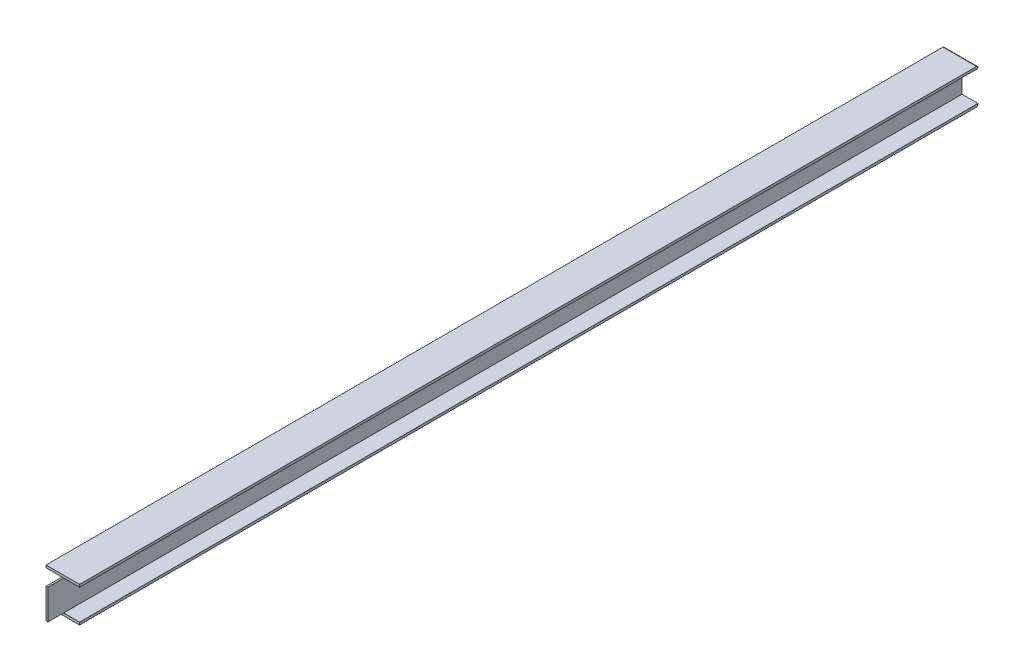
ISO-10303-21;
HEADER;
FILE_DESCRIPTION(('STEP AP214'),'2;1');
FILE_NAME('part.step','',(''),(''),'','','');
FILE_SCHEMA(('AUTOMOTIVE_DESIGN { 1 0 10303 214 1 1 1 1 }'));
ENDSEC;
DATA;
#1=APPLICATION_CONTEXT('core data for automotive mechanical design processes');
#2=APPLICATION_PROTOCOL_DEFINITION('international standard','automotive_design',2000,#1);
#3=PRODUCT_CONTEXT('',#1,'mechanical');
#4=PRODUCT('Part','Part','',(#3));
#5=PRODUCT_RELATED_PRODUCT_CATEGORY('part','',(#4));
#6=PRODUCT_DEFINITION_FORMATION('','',#4);
#7=PRODUCT_DEFINITION_CONTEXT('part definition',#1,'design');
#8=PRODUCT_DEFINITION('design','',#6,#7);
#9=PRODUCT_DEFINITION_SHAPE('','',#8);
#10=(LENGTH_UNIT() NAMED_UNIT(*) SI_UNIT(.MILLI.,.METRE.));
#11=(NAMED_UNIT(*) PLANE_ANGLE_UNIT() SI_UNIT($,.RADIAN.));
#12=(NAMED_UNIT(*) SI_UNIT($,.STERADIAN.) SOLID_ANGLE_UNIT());
#13=UNCERTAINTY_MEASURE_WITH_UNIT(LENGTH_MEASURE(1.E-05),#10,'distance_accuracy_value','');
#14=(GEOMETRIC_REPRESENTATION_CONTEXT(3) GLOBAL_UNCERTAINTY_ASSIGNED_CONTEXT((#13)) GLOBAL_UNIT_ASSIGNED_CONTEXT((#10,
#11,#12)) REPRESENTATION_CONTEXT('',''));
#15=CARTESIAN_POINT('',(0.,0.,0.));
#16=DIRECTION('',(0.,0.,1.));
#17=DIRECTION('',(1.,0.,0.));
#18=AXIS2_PLACEMENT_3D('',#15,#16,#17);
#19=CARTESIAN_POINT('',(0.,-11.5572405329582,4000.));
#20=DIRECTION('',(1.,0.,0.));
#21=DIRECTION('',(0.,0.,-1.));
#22=AXIS2_PLACEMENT_3D('',#19,#20,#21);
#23=PLANE('',#22);
#24=DIRECTION('',(0.,0.,-1.));
#25=VECTOR('',#24,1.);
#26=CARTESIAN_POINT('',(0.,-0.000240532958150197,4000.));
#27=LINE('',#26,#25);
#28=CARTESIAN_POINT('',(0.,-0.000240532958150197,4089.32859467899));
#29=VERTEX_POINT('',#28);
#30=CARTESIAN_POINT('',(0.,-0.000240532958150197,-36.5886435541336));
#31=VERTEX_POINT('',#30);
#32=EDGE_CURVE('E194',#29,#31,#27,.T.);
#33=ORIENTED_EDGE('',*,*,#32,.T.);
#34=CARTESIAN_POINT('',(0.,-7.62024053295815,-36.5886435541336));
#35=DIRECTION('',(1.,0.,0.));
#36=DIRECTION('',(0.,0.,-1.));
#37=AXIS2_PLACEMENT_3D('',#34,#35,#36);
#38=CIRCLE('',#37,7.62);
#39=CARTESIAN_POINT('',(0.,-7.62024053295817,-44.2086435541342));
#40=VERTEX_POINT('',#39);
#41=EDGE_CURVE('E43',#31,#40,#38,.F.);
#42=ORIENTED_EDGE('',*,*,#41,.T.);
#43=DIRECTION('',(0.,-1.,0.));
#44=VECTOR('',#43,1.);
#45=CARTESIAN_POINT('',(0.,-11.5572405329576,-44.2086435541342));
#46=LINE('',#45,#44);
#47=CARTESIAN_POINT('',(0.,-11.5572405329582,-44.2086435541342));
#48=VERTEX_POINT('',#47);
#49=EDGE_CURVE('E269',#40,#48,#46,.T.);
#50=ORIENTED_EDGE('',*,*,#49,.T.);
#51=DIRECTION('',(0.,0.,-1.));
#52=VECTOR('',#51,1.);
#53=CARTESIAN_POINT('',(0.,-11.5572405329582,4000.));
#54=LINE('',#53,#52);
#55=CARTESIAN_POINT('',(0.,-11.5572405329582,4089.32859467899));
#56=VERTEX_POINT('',#55);
#57=EDGE_CURVE('E252',#56,#48,#54,.T.);
#58=ORIENTED_EDGE('',*,*,#57,.F.);
#59=DIRECTION('',(0.,-1.,0.));
#60=VECTOR('',#59,1.);
#61=CARTESIAN_POINT('',(0.,-0.000240532042825169,4089.32859467899));
#62=LINE('',#61,#60);
#63=EDGE_CURVE('E198',#29,#56,#62,.T.);
#64=ORIENTED_EDGE('',*,*,#63,.F.);
#65=EDGE_LOOP('',(#33,#42,#50,#58,#64));
#66=FACE_BOUND('',#65,.T.);
#67=ADVANCED_FACE('F35',(#66),#23,.F.);
#68=CARTESIAN_POINT('',(73.152,-11.5572405329581,4000.));
#69=DIRECTION('',(0.,1.,0.));
#70=DIRECTION('',(-1.,0.,0.));
#71=AXIS2_PLACEMENT_3D('',#68,#69,#70);
#72=PLANE('',#71);
#73=ORIENTED_EDGE('',*,*,#57,.T.);
#74=DIRECTION('',(1.,0.,0.));
#75=VECTOR('',#74,1.);
#76=CARTESIAN_POINT('',(73.1520000000001,-11.5572405329581,-44.2086435541342));
#77=LINE('',#76,#75);
#78=CARTESIAN_POINT('',(73.152,-11.5572405329581,-44.2086435541342));
#79=VERTEX_POINT('',#78);
#80=EDGE_CURVE('E177',#48,#79,#77,.T.);
#81=ORIENTED_EDGE('',*,*,#80,.T.);
#82=DIRECTION('',(0.,0.,-1.));
#83=VECTOR('',#82,1.);
#84=CARTESIAN_POINT('',(73.152,-11.5572405329581,4000.));
#85=LINE('',#84,#83);
#86=CARTESIAN_POINT('',(73.152,-11.5572405329581,4089.32859467899));
#87=VERTEX_POINT('',#86);
#88=EDGE_CURVE('E158',#87,#79,#85,.T.);
#89=ORIENTED_EDGE('',*,*,#88,.F.);
#90=DIRECTION('',(1.,0.,0.));
#91=VECTOR('',#90,1.);
#92=CARTESIAN_POINT('',(-2.70219519361302E-10,-11.5572405329582,4089.32859467899));
#93=LINE('',#92,#91);
#94=EDGE_CURVE('E201',#56,#87,#93,.T.);
#95=ORIENTED_EDGE('',*,*,#94,.F.);
#96=EDGE_LOOP('',(#73,#81,#89,#95));
#97=FACE_BOUND('',#96,.T.);
#98=ADVANCED_FACE('F342',(#97),#72,.F.);
#99=CARTESIAN_POINT('',(73.152,-150.495240532958,4000.));
#100=DIRECTION('',(1.,0.,0.));
#101=DIRECTION('',(0.,0.,-1.));
#102=AXIS2_PLACEMENT_3D('',#99,#100,#101);
#103=PLANE('',#102);
#104=ORIENTED_EDGE('',*,*,#88,.T.);
#105=DIRECTION('',(0.,-1.,0.));
#106=VECTOR('',#105,1.);
#107=CARTESIAN_POINT('',(73.152,-150.495240532958,-44.2086435541338));
#108=LINE('',#107,#106);
#109=CARTESIAN_POINT('',(73.152,-150.495240532958,-44.208643554134));
#110=VERTEX_POINT('',#109);
#111=EDGE_CURVE('E167',#79,#110,#108,.T.);
#112=ORIENTED_EDGE('',*,*,#111,.T.);
#113=DIRECTION('',(0.,0.,-1.));
#114=VECTOR('',#113,1.);
#115=CARTESIAN_POINT('',(73.152,-150.495240532958,4000.));
#116=LINE('',#115,#114);
#117=CARTESIAN_POINT('',(73.152,-150.495240532958,4089.32859467899));
#118=VERTEX_POINT('',#117);
#119=EDGE_CURVE('E147',#118,#110,#116,.T.);
#120=ORIENTED_EDGE('',*,*,#119,.F.);
#121=DIRECTION('',(0.,0.,-1.));
#122=VECTOR('',#121,1.);
#123=CARTESIAN_POINT('',(73.152,-150.495240532958,500000.));
#124=LINE('',#123,#122);
#125=CARTESIAN_POINT('',(73.152,-150.495240532958,4162.48059467898));
#126=VERTEX_POINT('',#125);
#127=EDGE_CURVE('E187',#126,#118,#124,.T.);
#128=ORIENTED_EDGE('',*,*,#127,.F.);
#129=DIRECTION('',(0.,-1.,0.));
#130=VECTOR('',#129,1.);
#131=CARTESIAN_POINT('',(73.152,-11.5572405319948,4162.48059467898));
#132=LINE('',#131,#130);
#133=CARTESIAN_POINT('',(73.152,-11.5572405329581,4162.48059467904));
#134=VERTEX_POINT('',#133);
#135=EDGE_CURVE('E204',#134,#126,#132,.T.);
#136=ORIENTED_EDGE('',*,*,#135,.F.);
#137=DIRECTION('',(0.,0.,-1.));
#138=VECTOR('',#137,1.);
#139=CARTESIAN_POINT('',(73.152,-11.5572405329581,500000.));
#140=LINE('',#139,#138);
#141=EDGE_CURVE('E182',#134,#87,#140,.T.);
#142=ORIENTED_EDGE('',*,*,#141,.T.);
#143=EDGE_LOOP('',(#104,#112,#120,#128,#136,#142));
#144=FACE_BOUND('',#143,.T.);
#145=ADVANCED_FACE('F172',(#144),#103,.F.);
#146=CARTESIAN_POINT('',(0.,-150.495240532958,4000.));
#147=DIRECTION('',(0.,-1.,0.));
#148=DIRECTION('',(1.,0.,0.));
#149=AXIS2_PLACEMENT_3D('',#146,#147,#148);
#150=PLANE('',#149);
#151=ORIENTED_EDGE('',*,*,#119,.T.);
#152=DIRECTION('',(-1.,0.,0.));
#153=VECTOR('',#152,1.);
#154=CARTESIAN_POINT('',(0.,-150.495240532958,-44.2086435541338));
#155=LINE('',#154,#153);
#156=CARTESIAN_POINT('',(0.,-150.495240532958,-44.2086435541338));
#157=VERTEX_POINT('',#156);
#158=EDGE_CURVE('E150',#110,#157,#155,.T.);
#159=ORIENTED_EDGE('',*,*,#158,.T.);
#160=DIRECTION('',(0.,0.,-1.));
#161=VECTOR('',#160,1.);
#162=CARTESIAN_POINT('',(0.,-150.495240532958,4000.));
#163=LINE('',#162,#161);
#164=CARTESIAN_POINT('',(0.,-150.495240532958,4089.32859467899));
#165=VERTEX_POINT('',#164);
#166=EDGE_CURVE('E159',#165,#157,#163,.T.);
#167=ORIENTED_EDGE('',*,*,#166,.F.);
#168=DIRECTION('',(-1.,0.,0.));
#169=VECTOR('',#168,1.);
#170=CARTESIAN_POINT('',(2536.71527549689,-150.495240532952,4089.328594679));
#171=LINE('',#170,#169);
#172=EDGE_CURVE('E152',#118,#165,#171,.T.);
#173=ORIENTED_EDGE('',*,*,#172,.F.);
#174=EDGE_LOOP('',(#151,#159,#167,#173));
#175=FACE_BOUND('',#174,.T.);
#176=ADVANCED_FACE('F149',(#175),#150,.F.);
#177=CARTESIAN_POINT('',(0.,-162.052240532958,4000.));
#178=DIRECTION('',(1.,0.,0.));
#179=DIRECTION('',(0.,1.,0.));
#180=AXIS2_PLACEMENT_3D('',#177,#178,#179);
#181=PLANE('',#180);
#182=DIRECTION('',(0.,-1.,0.));
#183=VECTOR('',#182,1.);
#184=CARTESIAN_POINT('',(0.,-162.052240532958,-44.2086435541338));
#185=LINE('',#184,#183);
#186=CARTESIAN_POINT('',(0.,-154.432240532958,-44.2086435541338));
#187=VERTEX_POINT('',#186);
#188=EDGE_CURVE('E170',#157,#187,#185,.T.);
#189=ORIENTED_EDGE('',*,*,#188,.T.);
#190=CARTESIAN_POINT('',(0.,-154.432240532958,-36.5886435541335));
#191=DIRECTION('',(1.,0.,0.));
#192=DIRECTION('',(0.,1.,0.));
#193=AXIS2_PLACEMENT_3D('',#190,#191,#192);
#194=CIRCLE('',#193,7.62);
#195=CARTESIAN_POINT('',(0.,-162.052240532958,-36.5886435541336));
#196=VERTEX_POINT('',#195);
#197=EDGE_CURVE('E264',#187,#196,#194,.F.);
#198=ORIENTED_EDGE('',*,*,#197,.T.);
#199=DIRECTION('',(0.,0.,-1.));
#200=VECTOR('',#199,1.);
#201=CARTESIAN_POINT('',(0.,-162.052240532958,4000.));
#202=LINE('',#201,#200);
#203=CARTESIAN_POINT('',(0.,-162.052240532958,4089.32859467899));
#204=VERTEX_POINT('',#203);
#205=EDGE_CURVE('E247',#204,#196,#202,.T.);
#206=ORIENTED_EDGE('',*,*,#205,.F.);
#207=DIRECTION('',(0.,-1.,0.));
#208=VECTOR('',#207,1.);
#209=CARTESIAN_POINT('',(0.,-150.495240532043,4089.32859467899));
#210=LINE('',#209,#208);
#211=EDGE_CURVE('E209',#165,#204,#210,.T.);
#212=ORIENTED_EDGE('',*,*,#211,.F.);
#213=ORIENTED_EDGE('',*,*,#166,.T.);
#214=EDGE_LOOP('',(#189,#198,#206,#212,#213));
#215=FACE_BOUND('',#214,.T.);
#216=ADVANCED_FACE('F301',(#215),#181,.F.);
#217=CARTESIAN_POINT('',(154.432,-162.052240532958,4000.));
#218=DIRECTION('',(0.,1.,0.));
#219=DIRECTION('',(-1.,0.,0.));
#220=AXIS2_PLACEMENT_3D('',#217,#218,#219);
#221=PLANE('',#220);
#222=ORIENTED_EDGE('',*,*,#205,.T.);
#223=DIRECTION('',(1.,0.,0.));
#224=VECTOR('',#223,1.);
#225=CARTESIAN_POINT('',(154.431999999998,-162.052240532958,-36.5886435541336));
#226=LINE('',#225,#224);
#227=CARTESIAN_POINT('',(154.432,-162.052240532958,-36.5886435541336));
#228=VERTEX_POINT('',#227);
#229=EDGE_CURVE('E255',#196,#228,#226,.T.);
#230=ORIENTED_EDGE('',*,*,#229,.T.);
#231=DIRECTION('',(0.,0.,-1.));
#232=VECTOR('',#231,1.);
#233=CARTESIAN_POINT('',(154.432,-162.052240532958,4000.));
#234=LINE('',#233,#232);
#235=CARTESIAN_POINT('',(154.432,-162.052240532958,4089.32859467899));
#236=VERTEX_POINT('',#235);
#237=EDGE_CURVE('E244',#236,#228,#234,.T.);
#238=ORIENTED_EDGE('',*,*,#237,.F.);
#239=DIRECTION('',(-1.,0.,0.));
#240=VECTOR('',#239,1.);
#241=CARTESIAN_POINT('',(2536.71527549689,-162.052240532951,4089.328594679));
#242=LINE('',#241,#240);
#243=EDGE_CURVE('E179',#236,#204,#242,.T.);
#244=ORIENTED_EDGE('',*,*,#243,.T.);
#245=EDGE_LOOP('',(#222,#230,#238,#244));
#246=FACE_BOUND('',#245,.T.);
#247=ADVANCED_FACE('F308',(#246),#221,.F.);
#248=CARTESIAN_POINT('',(154.432,-150.495240532958,4000.));
#249=DIRECTION('',(-1.,0.,0.));
#250=DIRECTION('',(0.,0.,1.));
#251=AXIS2_PLACEMENT_3D('',#248,#249,#250);
#252=PLANE('',#251);
#253=ORIENTED_EDGE('',*,*,#237,.T.);
#254=CARTESIAN_POINT('',(154.432,-154.432240532958,-36.5886435541336));
#255=DIRECTION('',(-1.,0.,0.));
#256=DIRECTION('',(0.,0.,1.));
#257=AXIS2_PLACEMENT_3D('',#254,#255,#256);
#258=CIRCLE('',#257,7.62);
#259=CARTESIAN_POINT('',(154.432,-154.432240532958,-44.2086435541339));
#260=VERTEX_POINT('',#259);
#261=EDGE_CURVE('E258',#228,#260,#258,.F.);
#262=ORIENTED_EDGE('',*,*,#261,.T.);
#263=DIRECTION('',(0.,1.,0.));
#264=VECTOR('',#263,1.);
#265=CARTESIAN_POINT('',(154.432,-150.495240532958,-44.2086435541339));
#266=LINE('',#265,#264);
#267=CARTESIAN_POINT('',(154.432,-150.495240532958,-44.2086435541339));
#268=VERTEX_POINT('',#267);
#269=EDGE_CURVE('E297',#260,#268,#266,.T.);
#270=ORIENTED_EDGE('',*,*,#269,.T.);
#271=DIRECTION('',(0.,0.,-1.));
#272=VECTOR('',#271,1.);
#273=CARTESIAN_POINT('',(154.432,-150.495240532958,4000.));
#274=LINE('',#273,#272);
#275=CARTESIAN_POINT('',(154.432,-150.495240532958,4089.32859467899));
#276=VERTEX_POINT('',#275);
#277=EDGE_CURVE('E241',#276,#268,#274,.T.);
#278=ORIENTED_EDGE('',*,*,#277,.F.);
#279=DIRECTION('',(0.,1.,0.));
#280=VECTOR('',#279,1.);
#281=CARTESIAN_POINT('',(154.432,-162.052240532043,4089.32859467899));
#282=LINE('',#281,#280);
#283=EDGE_CURVE('E212',#236,#276,#282,.T.);
#284=ORIENTED_EDGE('',*,*,#283,.F.);
#285=EDGE_LOOP('',(#253,#262,#270,#278,#284));
#286=FACE_BOUND('',#285,.T.);
#287=ADVANCED_FACE('F311',(#286),#252,.F.);
#288=CARTESIAN_POINT('',(81.28,-150.495240532958,4000.));
#289=DIRECTION('',(0.,-1.,0.));
#290=DIRECTION('',(1.,0.,0.));
#291=AXIS2_PLACEMENT_3D('',#288,#289,#290);
#292=PLANE('',#291);
#293=ORIENTED_EDGE('',*,*,#277,.T.);
#294=DIRECTION('',(-1.,0.,0.));
#295=VECTOR('',#294,1.);
#296=CARTESIAN_POINT('',(81.2800000000001,-150.495240532958,-44.2086435541338));
#297=LINE('',#296,#295);
#298=CARTESIAN_POINT('',(81.28,-150.495240532958,-44.2086435541338));
#299=VERTEX_POINT('',#298);
#300=EDGE_CURVE('E292',#268,#299,#297,.T.);
#301=ORIENTED_EDGE('',*,*,#300,.T.);
#302=DIRECTION('',(0.,0.,-1.));
#303=VECTOR('',#302,1.);
#304=CARTESIAN_POINT('',(81.28,-150.495240532958,4000.));
#305=LINE('',#304,#303);
#306=CARTESIAN_POINT('',(81.28,-150.495240532958,4089.32859467899));
#307=VERTEX_POINT('',#306);
#308=EDGE_CURVE('E239',#307,#299,#305,.T.);
#309=ORIENTED_EDGE('',*,*,#308,.F.);
#310=EDGE_CURVE('E208',#276,#307,#171,.T.);
#311=ORIENTED_EDGE('',*,*,#310,.F.);
#312=EDGE_LOOP('',(#293,#301,#309,#311));
#313=FACE_BOUND('',#312,.T.);
#314=ADVANCED_FACE('F319',(#313),#292,.F.);
#315=CARTESIAN_POINT('',(81.28,-11.5572405329582,4000.));
#316=DIRECTION('',(-1.,0.,0.));
#317=DIRECTION('',(0.,-1.,0.));
#318=AXIS2_PLACEMENT_3D('',#315,#316,#317);
#319=PLANE('',#318);
#320=ORIENTED_EDGE('',*,*,#308,.T.);
#321=DIRECTION('',(0.,1.,0.));
#322=VECTOR('',#321,1.);
#323=CARTESIAN_POINT('',(81.28,-11.5572405329576,-44.2086435541342));
#324=LINE('',#323,#322);
#325=CARTESIAN_POINT('',(81.28,-11.5572405329582,-44.2086435541342));
#326=VERTEX_POINT('',#325);
#327=EDGE_CURVE('E289',#299,#326,#324,.T.);
#328=ORIENTED_EDGE('',*,*,#327,.T.);
#329=DIRECTION('',(0.,0.,-1.));
#330=VECTOR('',#329,1.);
#331=CARTESIAN_POINT('',(81.28,-11.5572405329582,4000.));
#332=LINE('',#331,#330);
#333=CARTESIAN_POINT('',(81.28,-11.5572405329582,4089.32859467899));
#334=VERTEX_POINT('',#333);
#335=EDGE_CURVE('E237',#334,#326,#332,.T.);
#336=ORIENTED_EDGE('',*,*,#335,.F.);
#337=DIRECTION('',(0.,0.,-1.));
#338=VECTOR('',#337,1.);
#339=CARTESIAN_POINT('',(81.28,-11.5572405329582,500000.));
#340=LINE('',#339,#338);
#341=CARTESIAN_POINT('',(81.28,-11.5572405329582,4162.48059467898));
#342=VERTEX_POINT('',#341);
#343=EDGE_CURVE('E184',#342,#334,#340,.T.);
#344=ORIENTED_EDGE('',*,*,#343,.F.);
#345=DIRECTION('',(0.,1.,0.));
#346=VECTOR('',#345,1.);
#347=CARTESIAN_POINT('',(81.28,-150.495240531995,4162.48059467898));
#348=LINE('',#347,#346);
#349=CARTESIAN_POINT('',(81.28,-150.495240532958,4162.48059467898));
#350=VERTEX_POINT('',#349);
#351=EDGE_CURVE('E215',#350,#342,#348,.T.);
#352=ORIENTED_EDGE('',*,*,#351,.F.);
#353=DIRECTION('',(0.,0.,-1.));
#354=VECTOR('',#353,1.);
#355=CARTESIAN_POINT('',(81.28,-150.495240532958,500000.));
#356=LINE('',#355,#354);
#357=EDGE_CURVE('E191',#350,#307,#356,.T.);
#358=ORIENTED_EDGE('',*,*,#357,.T.);
#359=EDGE_LOOP('',(#320,#328,#336,#344,#352,#358));
#360=FACE_BOUND('',#359,.T.);
#361=ADVANCED_FACE('F323',(#360),#319,.F.);
#362=CARTESIAN_POINT('',(154.432,-11.5572405329581,4000.));
#363=DIRECTION('',(0.,1.,0.));
#364=DIRECTION('',(-1.,0.,0.));
#365=AXIS2_PLACEMENT_3D('',#362,#363,#364);
#366=PLANE('',#365);
#367=ORIENTED_EDGE('',*,*,#335,.T.);
#368=DIRECTION('',(1.,0.,0.));
#369=VECTOR('',#368,1.);
#370=CARTESIAN_POINT('',(154.432,-11.5572405329581,-44.2086435541342));
#371=LINE('',#370,#369);
#372=CARTESIAN_POINT('',(154.432,-11.5572405329581,-44.2086435541342));
#373=VERTEX_POINT('',#372);
#374=EDGE_CURVE('E286',#326,#373,#371,.T.);
#375=ORIENTED_EDGE('',*,*,#374,.T.);
#376=DIRECTION('',(0.,0.,-1.));
#377=VECTOR('',#376,1.);
#378=CARTESIAN_POINT('',(154.432,-11.5572405329581,4000.));
#379=LINE('',#378,#377);
#380=CARTESIAN_POINT('',(154.432,-11.5572405329581,4089.32859467899));
#381=VERTEX_POINT('',#380);
#382=EDGE_CURVE('E235',#381,#373,#379,.T.);
#383=ORIENTED_EDGE('',*,*,#382,.F.);
#384=DIRECTION('',(1.,0.,0.));
#385=VECTOR('',#384,1.);
#386=CARTESIAN_POINT('',(81.2799999997298,-11.5572405329582,4089.32859467899));
#387=LINE('',#386,#385);
#388=EDGE_CURVE('E218',#334,#381,#387,.T.);
#389=ORIENTED_EDGE('',*,*,#388,.F.);
#390=EDGE_LOOP('',(#367,#375,#383,#389));
#391=FACE_BOUND('',#390,.T.);
#392=ADVANCED_FACE('F283',(#391),#366,.F.);
#393=CARTESIAN_POINT('',(154.432,-0.000240532958131285,4000.));
#394=DIRECTION('',(-1.,0.,0.));
#395=DIRECTION('',(0.,0.,1.));
#396=AXIS2_PLACEMENT_3D('',#393,#394,#395);
#397=PLANE('',#396);
#398=DIRECTION('',(0.,1.,0.));
#399=VECTOR('',#398,1.);
#400=CARTESIAN_POINT('',(154.432,-0.000240532957541034,-44.2086435541343));
#401=LINE('',#400,#399);
#402=CARTESIAN_POINT('',(154.432,-7.62024053295815,-44.2086435541342));
#403=VERTEX_POINT('',#402);
#404=EDGE_CURVE('E272',#373,#403,#401,.T.);
#405=ORIENTED_EDGE('',*,*,#404,.T.);
#406=CARTESIAN_POINT('',(154.432,-7.62024053295813,-36.5886435541337));
#407=DIRECTION('',(-1.,0.,0.));
#408=DIRECTION('',(0.,0.,1.));
#409=AXIS2_PLACEMENT_3D('',#406,#407,#408);
#410=CIRCLE('',#409,7.62);
#411=CARTESIAN_POINT('',(154.432,-0.000240532958131285,-36.5886435541336));
#412=VERTEX_POINT('',#411);
#413=EDGE_CURVE('E11',#403,#412,#410,.F.);
#414=ORIENTED_EDGE('',*,*,#413,.T.);
#415=DIRECTION('',(0.,0.,-1.));
#416=VECTOR('',#415,1.);
#417=CARTESIAN_POINT('',(154.432,-0.000240532958131285,4000.));
#418=LINE('',#417,#416);
#419=CARTESIAN_POINT('',(154.432,-0.000240532958131285,4089.32859467899));
#420=VERTEX_POINT('',#419);
#421=EDGE_CURVE('E233',#420,#412,#418,.T.);
#422=ORIENTED_EDGE('',*,*,#421,.F.);
#423=DIRECTION('',(0.,1.,0.));
#424=VECTOR('',#423,1.);
#425=CARTESIAN_POINT('',(154.432,-11.5572405320428,4089.32859467899));
#426=LINE('',#425,#424);
#427=EDGE_CURVE('E190',#381,#420,#426,.T.);
#428=ORIENTED_EDGE('',*,*,#427,.F.);
#429=ORIENTED_EDGE('',*,*,#382,.T.);
#430=EDGE_LOOP('',(#405,#414,#422,#428,#429));
#431=FACE_BOUND('',#430,.T.);
#432=ADVANCED_FACE('F277',(#431),#397,.F.);
#433=CARTESIAN_POINT('',(0.,-0.000240532958150197,4000.));
#434=DIRECTION('',(0.,-1.,0.));
#435=DIRECTION('',(1.,0.,0.));
#436=AXIS2_PLACEMENT_3D('',#433,#434,#435);
#437=PLANE('',#436);
#438=ORIENTED_EDGE('',*,*,#421,.T.);
#439=DIRECTION('',(-1.,0.,0.));
#440=VECTOR('',#439,1.);
#441=CARTESIAN_POINT('',(-1.47813193359222E-12,-0.000240532958150197,-36.5886435541336));
#442=LINE('',#441,#440);
#443=EDGE_CURVE('E266',#412,#31,#442,.T.);
#444=ORIENTED_EDGE('',*,*,#443,.T.);
#445=ORIENTED_EDGE('',*,*,#32,.F.);
#446=DIRECTION('',(-1.,0.,0.));
#447=VECTOR('',#446,1.);
#448=CARTESIAN_POINT('',(2536.71527549689,-0.000240532950041915,4089.32859467901));
#449=LINE('',#448,#447);
#450=EDGE_CURVE('E183',#420,#29,#449,.T.);
#451=ORIENTED_EDGE('',*,*,#450,.F.);
#452=EDGE_LOOP('',(#438,#444,#445,#451));
#453=FACE_BOUND('',#452,.T.);
#454=ADVANCED_FACE('F274',(#453),#437,.F.);
#455=CARTESIAN_POINT('',(2536.71527549689,-0.000240532950041915,4089.32859467901));
#456=DIRECTION('',(0.,0.,1.00000000000001));
#457=DIRECTION('',(1.,0.,0.));
#458=AXIS2_PLACEMENT_3D('',#455,#456,#457);
#459=PLANE('',#458);
#460=ORIENTED_EDGE('',*,*,#63,.T.);
#461=ORIENTED_EDGE('',*,*,#94,.T.);
#462=DIRECTION('',(-1.,0.,0.));
#463=VECTOR('',#462,1.);
#464=CARTESIAN_POINT('',(2536.71527549689,-11.5572405329408,4089.32859467898));
#465=LINE('',#464,#463);
#466=EDGE_CURVE('E228',#334,#87,#465,.T.);
#467=ORIENTED_EDGE('',*,*,#466,.F.);
#468=ORIENTED_EDGE('',*,*,#388,.T.);
#469=ORIENTED_EDGE('',*,*,#427,.T.);
#470=ORIENTED_EDGE('',*,*,#450,.T.);
#471=EDGE_LOOP('',(#460,#461,#467,#468,#469,#470));
#472=FACE_BOUND('',#471,.T.);
#473=ADVANCED_FACE('F281',(#472),#459,.T.);
#474=CARTESIAN_POINT('',(2536.71527549689,-11.5572405329408,4089.32859467898));
#475=DIRECTION('',(0.,1.00000000000001,0.));
#476=DIRECTION('',(0.,0.,1.00000000000001));
#477=AXIS2_PLACEMENT_3D('',#474,#475,#476);
#478=PLANE('',#477);
#479=ORIENTED_EDGE('',*,*,#141,.F.);
#480=DIRECTION('',(-1.,0.,0.));
#481=VECTOR('',#480,1.);
#482=CARTESIAN_POINT('',(2536.71527549689,-11.5572405329502,4162.48059467901));
#483=LINE('',#482,#481);
#484=EDGE_CURVE('E225',#342,#134,#483,.T.);
#485=ORIENTED_EDGE('',*,*,#484,.F.);
#486=ORIENTED_EDGE('',*,*,#343,.T.);
#487=ORIENTED_EDGE('',*,*,#466,.T.);
#488=EDGE_LOOP('',(#479,#485,#486,#487));
#489=FACE_BOUND('',#488,.T.);
#490=ADVANCED_FACE('F332',(#489),#478,.T.);
#491=CARTESIAN_POINT('',(2536.71527549689,-11.5572405329502,4162.48059467901));
#492=DIRECTION('',(0.,0.,1.00000000000001));
#493=DIRECTION('',(0.,-1.00000000000001,0.));
#494=AXIS2_PLACEMENT_3D('',#491,#492,#493);
#495=PLANE('',#494);
#496=ORIENTED_EDGE('',*,*,#135,.T.);
#497=DIRECTION('',(-1.,0.,0.));
#498=VECTOR('',#497,1.);
#499=CARTESIAN_POINT('',(2536.71527549684,-150.495240532951,4162.480594679));
#500=LINE('',#499,#498);
#501=EDGE_CURVE('E207',#350,#126,#500,.T.);
#502=ORIENTED_EDGE('',*,*,#501,.F.);
#503=ORIENTED_EDGE('',*,*,#351,.T.);
#504=ORIENTED_EDGE('',*,*,#484,.T.);
#505=EDGE_LOOP('',(#496,#502,#503,#504));
#506=FACE_BOUND('',#505,.T.);
#507=ADVANCED_FACE('F329',(#506),#495,.T.);
#508=CARTESIAN_POINT('',(2536.71527549684,-150.495240532951,4162.480594679));
#509=DIRECTION('',(0.,-1.00000000000001,0.));
#510=DIRECTION('',(0.,0.,-1.00000000000001));
#511=AXIS2_PLACEMENT_3D('',#508,#509,#510);
#512=PLANE('',#511);
#513=ORIENTED_EDGE('',*,*,#127,.T.);
#514=EDGE_CURVE('E188',#307,#118,#171,.T.);
#515=ORIENTED_EDGE('',*,*,#514,.F.);
#516=ORIENTED_EDGE('',*,*,#357,.F.);
#517=ORIENTED_EDGE('',*,*,#501,.T.);
#518=EDGE_LOOP('',(#513,#515,#516,#517));
#519=FACE_BOUND('',#518,.T.);
#520=ADVANCED_FACE('F326',(#519),#512,.T.);
#521=CARTESIAN_POINT('',(2536.71527549689,-150.495240532952,4089.328594679));
#522=DIRECTION('',(0.,0.,1.00000000000001));
#523=DIRECTION('',(1.,0.,0.));
#524=AXIS2_PLACEMENT_3D('',#521,#522,#523);
#525=PLANE('',#524);
#526=ORIENTED_EDGE('',*,*,#211,.T.);
#527=ORIENTED_EDGE('',*,*,#243,.F.);
#528=ORIENTED_EDGE('',*,*,#283,.T.);
#529=ORIENTED_EDGE('',*,*,#310,.T.);
#530=ORIENTED_EDGE('',*,*,#514,.T.);
#531=ORIENTED_EDGE('',*,*,#172,.T.);
#532=EDGE_LOOP('',(#526,#527,#528,#529,#530,#531));
#533=FACE_BOUND('',#532,.T.);
#534=ADVANCED_FACE('F316',(#533),#525,.T.);
#535=CARTESIAN_POINT('',(317.103012313581,-162.86530059422,-44.2086435541339));
#536=DIRECTION('',(0.,0.,1.));
#537=DIRECTION('',(0.,1.,0.));
#538=AXIS2_PLACEMENT_3D('',#535,#536,#537);
#539=PLANE('',#538);
#540=ORIENTED_EDGE('',*,*,#269,.F.);
#541=DIRECTION('',(1.,0.,0.));
#542=VECTOR('',#541,1.);
#543=CARTESIAN_POINT('',(317.103012313581,-154.432240532958,-44.2086435541339));
#544=LINE('',#543,#542);
#545=EDGE_CURVE('E262',#260,#187,#544,.F.);
#546=ORIENTED_EDGE('',*,*,#545,.T.);
#547=ORIENTED_EDGE('',*,*,#188,.F.);
#548=ORIENTED_EDGE('',*,*,#158,.F.);
#549=ORIENTED_EDGE('',*,*,#111,.F.);
#550=ORIENTED_EDGE('',*,*,#80,.F.);
#551=ORIENTED_EDGE('',*,*,#49,.F.);
#552=DIRECTION('',(-1.,0.,0.));
#553=VECTOR('',#552,1.);
#554=CARTESIAN_POINT('',(317.103012313581,-7.62024053295812,-44.2086435541343));
#555=LINE('',#554,#553);
#556=EDGE_CURVE('E260',#40,#403,#555,.F.);
#557=ORIENTED_EDGE('',*,*,#556,.T.);
#558=ORIENTED_EDGE('',*,*,#404,.F.);
#559=ORIENTED_EDGE('',*,*,#374,.F.);
#560=ORIENTED_EDGE('',*,*,#327,.F.);
#561=ORIENTED_EDGE('',*,*,#300,.F.);
#562=EDGE_LOOP('',(#540,#546,#547,#548,#549,#550,#551,#557,#558,#559,#560,#561));
#563=FACE_BOUND('',#562,.T.);
#564=ADVANCED_FACE('F165',(#563),#539,.F.);
#565=CARTESIAN_POINT('',(154.431999999998,-154.432240532958,-36.5886435541336));
#566=DIRECTION('',(1.,0.,0.));
#567=DIRECTION('',(0.,0.,-1.));
#568=AXIS2_PLACEMENT_3D('',#565,#566,#567);
#569=CYLINDRICAL_SURFACE('',#568,7.62);
#570=ORIENTED_EDGE('',*,*,#197,.F.);
#571=ORIENTED_EDGE('',*,*,#545,.F.);
#572=ORIENTED_EDGE('',*,*,#261,.F.);
#573=ORIENTED_EDGE('',*,*,#229,.F.);
#574=EDGE_LOOP('',(#570,#571,#572,#573));
#575=FACE_BOUND('',#574,.T.);
#576=ADVANCED_FACE('F306',(#575),#569,.T.);
#577=CARTESIAN_POINT('',(-1.47719875370239E-12,-7.62024053295815,-36.5886435541336));
#578=DIRECTION('',(-1.,0.,0.));
#579=DIRECTION('',(0.,0.,1.));
#580=AXIS2_PLACEMENT_3D('',#577,#578,#579);
#581=CYLINDRICAL_SURFACE('',#580,7.62);
#582=ORIENTED_EDGE('',*,*,#413,.F.);
#583=ORIENTED_EDGE('',*,*,#556,.F.);
#584=ORIENTED_EDGE('',*,*,#41,.F.);
#585=ORIENTED_EDGE('',*,*,#443,.F.);
#586=EDGE_LOOP('',(#582,#583,#584,#585));
#587=FACE_BOUND('',#586,.T.);
#588=ADVANCED_FACE('F37',(#587),#581,.T.);
#589=CLOSED_SHELL('',(#67,#98,#145,#176,#216,#247,#287,#314,#361,#392,#432,#454,#473,#490,#507,
#520,#534,#564,#576,#588));
#590=MANIFOLD_SOLID_BREP('B2',#589);
#591=ADVANCED_BREP_SHAPE_REPRESENTATION('',(#18,#590),#14);
#592=SHAPE_DEFINITION_REPRESENTATION(#9,#591);
ENDSEC;
END-ISO-10303-21;
